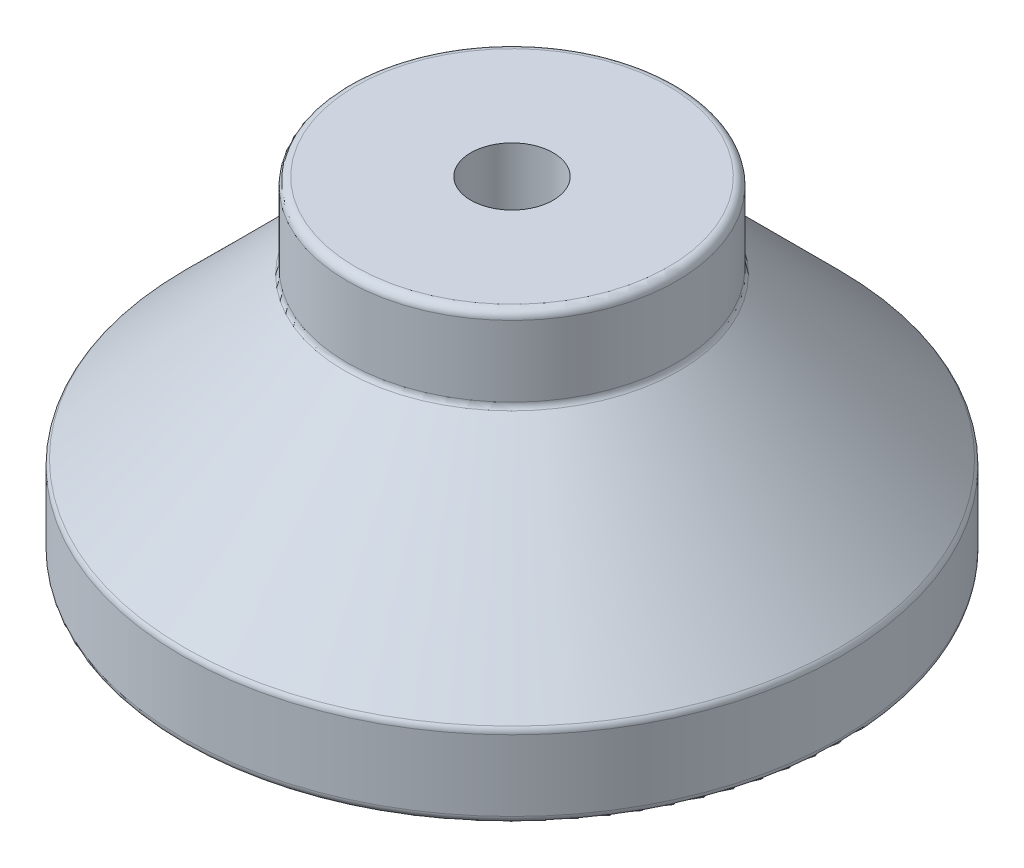
ISO-10303-21;
HEADER;
FILE_DESCRIPTION(('STEP AP214'),'2;1');
FILE_NAME('part.step','',(''),(''),'','','');
FILE_SCHEMA(('AUTOMOTIVE_DESIGN { 1 0 10303 214 1 1 1 1 }'));
ENDSEC;
DATA;
#1=APPLICATION_CONTEXT('core data for automotive mechanical design processes');
#2=APPLICATION_PROTOCOL_DEFINITION('international standard','automotive_design',2000,#1);
#3=PRODUCT_CONTEXT('',#1,'mechanical');
#4=PRODUCT('Part','Part','',(#3));
#5=PRODUCT_RELATED_PRODUCT_CATEGORY('part','',(#4));
#6=PRODUCT_DEFINITION_FORMATION('','',#4);
#7=PRODUCT_DEFINITION_CONTEXT('part definition',#1,'design');
#8=PRODUCT_DEFINITION('design','',#6,#7);
#9=PRODUCT_DEFINITION_SHAPE('','',#8);
#10=(LENGTH_UNIT() NAMED_UNIT(*) SI_UNIT(.MILLI.,.METRE.));
#11=(NAMED_UNIT(*) PLANE_ANGLE_UNIT() SI_UNIT($,.RADIAN.));
#12=(NAMED_UNIT(*) SI_UNIT($,.STERADIAN.) SOLID_ANGLE_UNIT());
#13=UNCERTAINTY_MEASURE_WITH_UNIT(LENGTH_MEASURE(1.E-05),#10,'distance_accuracy_value','');
#14=(GEOMETRIC_REPRESENTATION_CONTEXT(3) GLOBAL_UNCERTAINTY_ASSIGNED_CONTEXT((#13)) GLOBAL_UNIT_ASSIGNED_CONTEXT((#10,
#11,#12)) REPRESENTATION_CONTEXT('',''));
#15=CARTESIAN_POINT('',(0.,0.,0.));
#16=DIRECTION('',(0.,0.,1.));
#17=DIRECTION('',(1.,0.,0.));
#18=AXIS2_PLACEMENT_3D('',#15,#16,#17);
#19=CARTESIAN_POINT('',(0.,20.,0.));
#20=DIRECTION('',(0.,-1.,0.));
#21=DIRECTION('',(0.,0.,-1.));
#22=AXIS2_PLACEMENT_3D('',#19,#20,#21);
#23=CYLINDRICAL_SURFACE('',#22,20.);
#24=CARTESIAN_POINT('',(0.,4.79289321881343,0.));
#25=DIRECTION('',(0.,-1.,0.));
#26=DIRECTION('',(0.,0.,-1.));
#27=AXIS2_PLACEMENT_3D('',#24,#25,#26);
#28=CIRCLE('',#27,20.);
#29=CARTESIAN_POINT('',(0.,4.79289321881343,-20.));
#30=VERTEX_POINT('',#29);
#31=EDGE_CURVE('E63',#30,#30,#28,.T.);
#32=ORIENTED_EDGE('',*,*,#31,.T.);
#33=EDGE_LOOP('',(#32));
#34=FACE_BOUND('',#33,.T.);
#35=CARTESIAN_POINT('',(0.,0.5,0.));
#36=DIRECTION('',(0.,1.,0.));
#37=DIRECTION('',(0.,0.,1.));
#38=AXIS2_PLACEMENT_3D('',#35,#36,#37);
#39=CIRCLE('',#38,20.);
#40=CARTESIAN_POINT('',(0.,0.5,20.));
#41=VERTEX_POINT('',#40);
#42=EDGE_CURVE('E66',#41,#41,#39,.T.);
#43=ORIENTED_EDGE('',*,*,#42,.T.);
#44=EDGE_LOOP('',(#43));
#45=FACE_BOUND('',#44,.T.);
#46=ADVANCED_FACE('F43',(#34,#45),#23,.T.);
#47=CARTESIAN_POINT('',(0.,0.,0.));
#48=DIRECTION('',(0.,1.,0.));
#49=DIRECTION('',(0.,0.,1.));
#50=AXIS2_PLACEMENT_3D('',#47,#48,#49);
#51=PLANE('',#50);
#52=CARTESIAN_POINT('',(0.,0.,0.));
#53=DIRECTION('',(0.,1.,0.));
#54=DIRECTION('',(0.,0.,1.));
#55=AXIS2_PLACEMENT_3D('',#52,#53,#54);
#56=CIRCLE('',#55,19.5);
#57=CARTESIAN_POINT('',(0.,0.,19.5));
#58=VERTEX_POINT('',#57);
#59=EDGE_CURVE('E58',#58,#58,#56,.F.);
#60=ORIENTED_EDGE('',*,*,#59,.T.);
#61=EDGE_LOOP('',(#60));
#62=FACE_BOUND('',#61,.T.);
#63=ADVANCED_FACE('F98',(#62),#51,.F.);
#64=CARTESIAN_POINT('',(0.,5.,0.));
#65=DIRECTION('',(0.,1.,0.));
#66=DIRECTION('',(0.,0.,1.));
#67=AXIS2_PLACEMENT_3D('',#64,#65,#66);
#68=CYLINDRICAL_SURFACE('',#67,10.);
#69=CARTESIAN_POINT('',(0.,19.5,0.));
#70=DIRECTION('',(0.,1.,0.));
#71=DIRECTION('',(0.,0.,1.));
#72=AXIS2_PLACEMENT_3D('',#69,#70,#71);
#73=CIRCLE('',#72,10.);
#74=CARTESIAN_POINT('',(0.,19.5,10.));
#75=VERTEX_POINT('',#74);
#76=EDGE_CURVE('E11',#75,#75,#73,.F.);
#77=ORIENTED_EDGE('',*,*,#76,.T.);
#78=EDGE_LOOP('',(#77));
#79=FACE_BOUND('',#78,.T.);
#80=CARTESIAN_POINT('',(0.,15.2071067811866,0.));
#81=DIRECTION('',(0.,1.,0.));
#82=DIRECTION('',(0.,0.,1.));
#83=AXIS2_PLACEMENT_3D('',#80,#81,#82);
#84=CIRCLE('',#83,10.);
#85=CARTESIAN_POINT('',(0.,15.2071067811866,10.));
#86=VERTEX_POINT('',#85);
#87=EDGE_CURVE('E50',#86,#86,#84,.T.);
#88=ORIENTED_EDGE('',*,*,#87,.T.);
#89=EDGE_LOOP('',(#88));
#90=FACE_BOUND('',#89,.T.);
#91=ADVANCED_FACE('F92',(#79,#90),#68,.T.);
#92=CARTESIAN_POINT('',(0.,20.,0.));
#93=DIRECTION('',(0.,1.,0.));
#94=DIRECTION('',(0.,0.,1.));
#95=AXIS2_PLACEMENT_3D('',#92,#93,#94);
#96=PLANE('',#95);
#97=CARTESIAN_POINT('',(0.,20.,0.));
#98=DIRECTION('',(0.,1.,0.));
#99=DIRECTION('',(0.,0.,1.));
#100=AXIS2_PLACEMENT_3D('',#97,#98,#99);
#101=CIRCLE('',#100,9.5);
#102=CARTESIAN_POINT('',(0.,20.,9.5));
#103=VERTEX_POINT('',#102);
#104=EDGE_CURVE('E54',#103,#103,#101,.T.);
#105=ORIENTED_EDGE('',*,*,#104,.T.);
#106=EDGE_LOOP('',(#105));
#107=FACE_BOUND('',#106,.T.);
#108=CARTESIAN_POINT('',(0.,20.,0.));
#109=DIRECTION('',(0.,1.,0.));
#110=DIRECTION('',(0.,0.,1.));
#111=AXIS2_PLACEMENT_3D('',#108,#109,#110);
#112=CIRCLE('',#111,2.5);
#113=CARTESIAN_POINT('',(0.,20.,2.5));
#114=VERTEX_POINT('',#113);
#115=EDGE_CURVE('E76',#114,#114,#112,.T.);
#116=ORIENTED_EDGE('',*,*,#115,.F.);
#117=EDGE_LOOP('',(#116));
#118=FACE_BOUND('',#117,.T.);
#119=ADVANCED_FACE('F87',(#107,#118),#96,.T.);
#120=CARTESIAN_POINT('',(0.,5.,0.));
#121=DIRECTION('',(0.,1.,0.));
#122=DIRECTION('',(0.,0.,1.));
#123=AXIS2_PLACEMENT_3D('',#120,#121,#122);
#124=CYLINDRICAL_SURFACE('',#123,2.5);
#125=CARTESIAN_POINT('',(0.,5.,0.));
#126=DIRECTION('',(0.,1.,0.));
#127=DIRECTION('',(0.,0.,1.));
#128=AXIS2_PLACEMENT_3D('',#125,#126,#127);
#129=CIRCLE('',#128,2.5);
#130=CARTESIAN_POINT('',(0.,5.,2.5));
#131=VERTEX_POINT('',#130);
#132=EDGE_CURVE('E75',#131,#131,#129,.T.);
#133=ORIENTED_EDGE('',*,*,#132,.F.);
#134=EDGE_LOOP('',(#133));
#135=FACE_BOUND('',#134,.T.);
#136=ORIENTED_EDGE('',*,*,#115,.T.);
#137=EDGE_LOOP('',(#136));
#138=FACE_BOUND('',#137,.T.);
#139=ADVANCED_FACE('F84',(#135,#138),#124,.F.);
#140=CARTESIAN_POINT('',(0.,5.,0.));
#141=DIRECTION('',(0.,1.,0.));
#142=DIRECTION('',(0.,0.,1.));
#143=AXIS2_PLACEMENT_3D('',#140,#141,#142);
#144=PLANE('',#143);
#145=ORIENTED_EDGE('',*,*,#132,.T.);
#146=EDGE_LOOP('',(#145));
#147=FACE_BOUND('',#146,.T.);
#148=ADVANCED_FACE('F82',(#147),#144,.T.);
#149=CARTESIAN_POINT('',(0.,15.0000000000001,0.));
#150=DIRECTION('',(0.,-1.,0.));
#151=DIRECTION('',(0.,0.,-1.));
#152=AXIS2_PLACEMENT_3D('',#149,#150,#151);
#153=CONICAL_SURFACE('',#152,10.,0.785398163397443);
#154=CARTESIAN_POINT('',(0.,5.1464466094067,0.));
#155=DIRECTION('',(0.,1.,0.));
#156=DIRECTION('',(0.,0.,1.));
#157=AXIS2_PLACEMENT_3D('',#154,#155,#156);
#158=CIRCLE('',#157,19.8535533905933);
#159=CARTESIAN_POINT('',(0.,5.1464466094067,-19.8535533905933));
#160=VERTEX_POINT('',#159);
#161=EDGE_CURVE('E69',#160,#160,#158,.T.);
#162=CARTESIAN_POINT('',(0.,14.8535533905933,0.));
#163=DIRECTION('',(0.,1.,0.));
#164=DIRECTION('',(0.,0.,1.));
#165=AXIS2_PLACEMENT_3D('',#162,#163,#164);
#166=CIRCLE('',#165,10.1464466094067);
#167=CARTESIAN_POINT('',(0.,14.8535533905933,-10.1464466094067));
#168=VERTEX_POINT('',#167);
#169=EDGE_CURVE('E72',#168,#168,#166,.F.);
#170=CARTESIAN_POINT('',(0.,5.1464466094067,-19.8535533905933));
#171=CARTESIAN_POINT('',(0.,5.24756230504406,-19.7524376949559));
#172=CARTESIAN_POINT('',(0.,5.34867800068142,-19.6513219993186));
#173=CARTESIAN_POINT('',(0.,5.55090939195614,-19.4490906080438));
#174=CARTESIAN_POINT('',(0.,5.6520250875935,-19.3479749124065));
#175=CARTESIAN_POINT('',(0.,5.85425647886823,-19.1457435211318));
#176=CARTESIAN_POINT('',(0.,5.95537217450559,-19.0446278254944));
#177=CARTESIAN_POINT('',(0.,6.15760356578031,-18.8423964342197));
#178=CARTESIAN_POINT('',(0.,6.25871926141767,-18.7412807385823));
#179=CARTESIAN_POINT('',(0.,6.46095065269239,-18.5390493473076));
#180=CARTESIAN_POINT('',(0.,6.56206634832975,-18.4379336516702));
#181=CARTESIAN_POINT('',(0.,6.76429773960447,-18.2357022603955));
#182=CARTESIAN_POINT('',(0.,6.86541343524183,-18.1345865647582));
#183=CARTESIAN_POINT('',(0.,7.06764482651656,-17.9323551734834));
#184=CARTESIAN_POINT('',(0.,7.16876052215392,-17.8312394778461));
#185=CARTESIAN_POINT('',(0.,7.37099191342864,-17.6290080865714));
#186=CARTESIAN_POINT('',(0.,7.472107609066,-17.527892390934));
#187=CARTESIAN_POINT('',(0.,7.67433900034072,-17.3256609996593));
#188=CARTESIAN_POINT('',(0.,7.77545469597808,-17.2245453040219));
#189=CARTESIAN_POINT('',(0.,7.9776860872528,-17.0223139127472));
#190=CARTESIAN_POINT('',(0.,8.07880178289016,-16.9211982171098));
#191=CARTESIAN_POINT('',(0.,8.28103317416489,-16.7189668258351));
#192=CARTESIAN_POINT('',(0.,8.38214886980225,-16.6178511301978));
#193=CARTESIAN_POINT('',(0.,8.58438026107697,-16.415619738923));
#194=CARTESIAN_POINT('',(0.,8.68549595671433,-16.3145040432857));
#195=CARTESIAN_POINT('',(0.,8.88772734798905,-16.112272652011));
#196=CARTESIAN_POINT('',(0.,8.98884304362641,-16.0111569563736));
#197=CARTESIAN_POINT('',(0.,9.19107443490113,-15.8089255650989));
#198=CARTESIAN_POINT('',(0.,9.29219013053849,-15.7078098694615));
#199=CARTESIAN_POINT('',(0.,9.49442152181322,-15.5055784781868));
#200=CARTESIAN_POINT('',(0.,9.59553721745058,-15.4044627825494));
#201=CARTESIAN_POINT('',(0.,9.7977686087253,-15.2022313912747));
#202=CARTESIAN_POINT('',(0.,9.89888430436266,-15.1011156956374));
#203=CARTESIAN_POINT('',(0.,10.1011156956374,-14.8988843043626));
#204=CARTESIAN_POINT('',(0.,10.2022313912747,-14.7977686087253));
#205=CARTESIAN_POINT('',(0.,10.4044627825495,-14.5955372174506));
#206=CARTESIAN_POINT('',(0.,10.5055784781868,-14.4944215218132));
#207=CARTESIAN_POINT('',(0.,10.7078098694615,-14.2921901305385));
#208=CARTESIAN_POINT('',(0.,10.8089255650989,-14.1910744349011));
#209=CARTESIAN_POINT('',(0.,11.0111569563736,-13.9888430436264));
#210=CARTESIAN_POINT('',(0.,11.112272652011,-13.887727347989));
#211=CARTESIAN_POINT('',(0.,11.3145040432857,-13.6854959567143));
#212=CARTESIAN_POINT('',(0.,11.4156197389231,-13.584380261077));
#213=CARTESIAN_POINT('',(0.,11.6178511301978,-13.3821488698022));
#214=CARTESIAN_POINT('',(0.,11.7189668258352,-13.2810331741649));
#215=CARTESIAN_POINT('',(0.,11.9211982171099,-13.0788017828902));
#216=CARTESIAN_POINT('',(0.,12.0223139127472,-12.9776860872528));
#217=CARTESIAN_POINT('',(0.,12.224545304022,-12.7754546959781));
#218=CARTESIAN_POINT('',(0.,12.3256609996593,-12.6743390003407));
#219=CARTESIAN_POINT('',(0.,12.527892390934,-12.472107609066));
#220=CARTESIAN_POINT('',(0.,12.6290080865714,-12.3709919134286));
#221=CARTESIAN_POINT('',(0.,12.8312394778461,-12.1687605221539));
#222=CARTESIAN_POINT('',(0.,12.9323551734835,-12.0676448265166));
#223=CARTESIAN_POINT('',(0.,13.1345865647582,-11.8654134352418));
#224=CARTESIAN_POINT('',(0.,13.2357022603956,-11.7642977396045));
#225=CARTESIAN_POINT('',(0.,13.4379336516703,-11.5620663483298));
#226=CARTESIAN_POINT('',(0.,13.5390493473076,-11.4609506526924));
#227=CARTESIAN_POINT('',(0.,13.7412807385824,-11.2587192614177));
#228=CARTESIAN_POINT('',(0.,13.8423964342197,-11.1576035657803));
#229=CARTESIAN_POINT('',(0.,14.0446278254945,-10.9553721745056));
#230=CARTESIAN_POINT('',(0.,14.1457435211318,-10.8542564788682));
#231=CARTESIAN_POINT('',(0.,14.3479749124065,-10.6520250875935));
#232=CARTESIAN_POINT('',(0.,14.4490906080439,-10.5509093919562));
#233=CARTESIAN_POINT('',(0.,14.6513219993186,-10.3486780006814));
#234=CARTESIAN_POINT('',(0.,14.752437694956,-10.2475623050441));
#235=CARTESIAN_POINT('',(0.,14.8535533905933,-10.1464466094067));
#236=B_SPLINE_CURVE_WITH_KNOTS('',3,(#170,#171,#172,#173,#174,#175,#176,#177,#178,#179,#180,
#181,#182,#183,#184,#185,#186,#187,#188,#189,#190,#191,#192,#193,#194,#195,#196,#197,#198,#199,
#200,#201,#202,#203,#204,#205,#206,#207,#208,#209,#210,#211,#212,#213,#214,#215,#216,#217,#218,
#219,#220,#221,#222,#223,#224,#225,#226,#227,#228,#229,#230,#231,#232,#233,#234,#235),
.UNSPECIFIED.,.F.,.F.,(4,2,2,2,2,2,2,2,2,2,2,2,2,2,2,2,2,2,2,2,2,2,2,2,2,2,2,2,2,2,2,2,4),(0.,
0.428997564417436,0.857995128834869,1.2869926932523,1.71599025766974,2.14498782208717,
2.57398538650461,3.00298295092204,3.43198051533948,3.86097807975691,4.28997564417435,
4.71897320859179,5.14797077300922,5.57696833742665,6.00596590184409,6.43496346626152,
6.86396103067896,7.29295859509639,7.72195615951383,8.15095372393126,8.5799512883487,
9.00894885276613,9.43794641718357,9.866943981601,10.2959415460184,10.7249391104359,
11.1539366748533,11.5829342392707,12.0119318036882,12.4409293681056,12.869926932523,
13.2989244969405,13.7279220613579),.UNSPECIFIED.);
#237=EDGE_CURVE('BSEAM111',#160,#168,#236,.T.);
#238=ORIENTED_EDGE('',*,*,#161,.T.);
#239=ORIENTED_EDGE('',*,*,#169,.T.);
#240=ORIENTED_EDGE('',*,*,#237,.T.);
#241=ORIENTED_EDGE('',*,*,#237,.F.);
#242=EDGE_LOOP('',(#238,#240,#239,#241));
#243=FACE_BOUND('',#242,.T.);
#244=ADVANCED_FACE('F111',(#243),#153,.T.);
#245=CARTESIAN_POINT('',(0.,4.79289321881343,0.));
#246=DIRECTION('',(0.,-1.,0.));
#247=DIRECTION('',(0.,0.,-1.));
#248=AXIS2_PLACEMENT_3D('',#245,#246,#247);
#249=TOROIDAL_SURFACE('',#248,19.5,0.5);
#250=ORIENTED_EDGE('',*,*,#31,.F.);
#251=EDGE_LOOP('',(#250));
#252=FACE_BOUND('',#251,.T.);
#253=ORIENTED_EDGE('',*,*,#161,.F.);
#254=EDGE_LOOP('',(#253));
#255=FACE_BOUND('',#254,.T.);
#256=ADVANCED_FACE('F116',(#252,#255),#249,.T.);
#257=CARTESIAN_POINT('',(0.,0.5,0.));
#258=DIRECTION('',(0.,1.,0.));
#259=DIRECTION('',(0.,0.,1.));
#260=AXIS2_PLACEMENT_3D('',#257,#258,#259);
#261=TOROIDAL_SURFACE('',#260,19.5,0.5);
#262=ORIENTED_EDGE('',*,*,#59,.F.);
#263=EDGE_LOOP('',(#262));
#264=FACE_BOUND('',#263,.T.);
#265=ORIENTED_EDGE('',*,*,#42,.F.);
#266=EDGE_LOOP('',(#265));
#267=FACE_BOUND('',#266,.T.);
#268=ADVANCED_FACE('F120',(#264,#267),#261,.T.);
#269=CARTESIAN_POINT('',(0.,19.5,0.));
#270=DIRECTION('',(0.,1.,0.));
#271=DIRECTION('',(0.,0.,1.));
#272=AXIS2_PLACEMENT_3D('',#269,#270,#271);
#273=TOROIDAL_SURFACE('',#272,9.5,0.5);
#274=ORIENTED_EDGE('',*,*,#76,.F.);
#275=EDGE_LOOP('',(#274));
#276=FACE_BOUND('',#275,.T.);
#277=ORIENTED_EDGE('',*,*,#104,.F.);
#278=EDGE_LOOP('',(#277));
#279=FACE_BOUND('',#278,.T.);
#280=ADVANCED_FACE('F123',(#276,#279),#273,.T.);
#281=CARTESIAN_POINT('',(0.,15.2071067811866,0.));
#282=DIRECTION('',(0.,1.,0.));
#283=DIRECTION('',(0.,0.,1.));
#284=AXIS2_PLACEMENT_3D('',#281,#282,#283);
#285=TOROIDAL_SURFACE('',#284,10.5,0.5);
#286=ORIENTED_EDGE('',*,*,#169,.F.);
#287=EDGE_LOOP('',(#286));
#288=FACE_BOUND('',#287,.T.);
#289=ORIENTED_EDGE('',*,*,#87,.F.);
#290=EDGE_LOOP('',(#289));
#291=FACE_BOUND('',#290,.T.);
#292=ADVANCED_FACE('F45',(#288,#291),#285,.F.);
#293=CLOSED_SHELL('',(#46,#63,#91,#119,#139,#148,#244,#256,#268,#280,#292));
#294=MANIFOLD_SOLID_BREP('B2',#293);
#295=ADVANCED_BREP_SHAPE_REPRESENTATION('',(#18,#294),#14);
#296=SHAPE_DEFINITION_REPRESENTATION(#9,#295);
ENDSEC;
END-ISO-10303-21;
